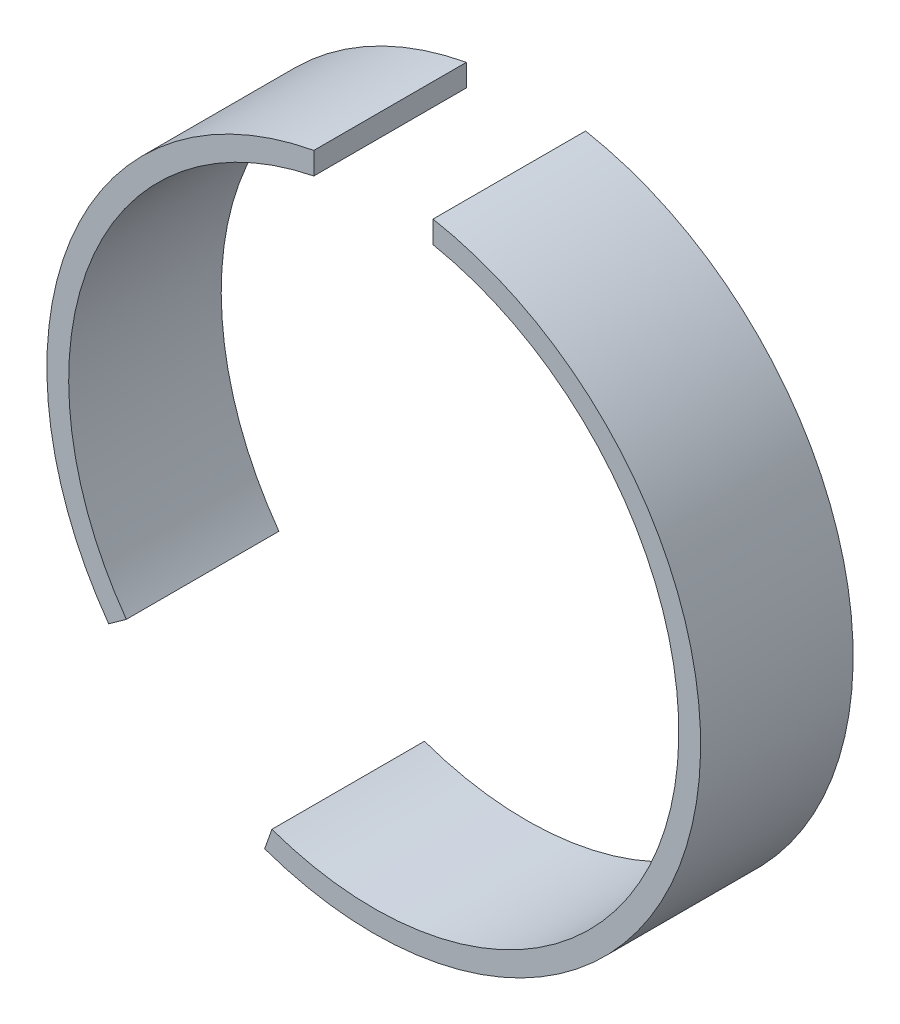
ISO-10303-21;
HEADER;
FILE_DESCRIPTION(('STEP AP214'),'2;1');
FILE_NAME('part.step','',(''),(''),'','','');
FILE_SCHEMA(('AUTOMOTIVE_DESIGN { 1 0 10303 214 1 1 1 1 }'));
ENDSEC;
DATA;
#1=APPLICATION_CONTEXT('core data for automotive mechanical design processes');
#2=APPLICATION_PROTOCOL_DEFINITION('international standard','automotive_design',2000,#1);
#3=PRODUCT_CONTEXT('',#1,'mechanical');
#4=PRODUCT('Part','Part','',(#3));
#5=PRODUCT_RELATED_PRODUCT_CATEGORY('part','',(#4));
#6=PRODUCT_DEFINITION_FORMATION('','',#4);
#7=PRODUCT_DEFINITION_CONTEXT('part definition',#1,'design');
#8=PRODUCT_DEFINITION('design','',#6,#7);
#9=PRODUCT_DEFINITION_SHAPE('','',#8);
#10=(LENGTH_UNIT() NAMED_UNIT(*) SI_UNIT(.MILLI.,.METRE.));
#11=(NAMED_UNIT(*) PLANE_ANGLE_UNIT() SI_UNIT($,.RADIAN.));
#12=(NAMED_UNIT(*) SI_UNIT($,.STERADIAN.) SOLID_ANGLE_UNIT());
#13=UNCERTAINTY_MEASURE_WITH_UNIT(LENGTH_MEASURE(1.E-05),#10,'distance_accuracy_value','');
#14=(GEOMETRIC_REPRESENTATION_CONTEXT(3) GLOBAL_UNCERTAINTY_ASSIGNED_CONTEXT((#13)) GLOBAL_UNIT_ASSIGNED_CONTEXT((#10,
#11,#12)) REPRESENTATION_CONTEXT('',''));
#15=CARTESIAN_POINT('',(0.,0.,0.));
#16=DIRECTION('',(0.,0.,1.));
#17=DIRECTION('',(1.,0.,0.));
#18=AXIS2_PLACEMENT_3D('',#15,#16,#17);
#19=CARTESIAN_POINT('',(0.,0.,14.));
#20=DIRECTION('',(0.,0.,-1.));
#21=DIRECTION('',(-1.,0.,0.));
#22=AXIS2_PLACEMENT_3D('',#19,#20,#21);
#23=CYLINDRICAL_SURFACE('',#22,28.);
#24=CARTESIAN_POINT('',(0.,0.,0.));
#25=DIRECTION('',(0.,0.,-1.));
#26=DIRECTION('',(1.,0.,0.));
#27=AXIS2_PLACEMENT_3D('',#24,#25,#26);
#28=CIRCLE('',#27,28.);
#29=CARTESIAN_POINT('',(-22.7044689300606,-16.3861859687944,0.));
#30=VERTEX_POINT('',#29);
#31=CARTESIAN_POINT('',(-5.50000000000001,27.4545078265847,0.));
#32=VERTEX_POINT('',#31);
#33=EDGE_CURVE('E112',#30,#32,#28,.T.);
#34=ORIENTED_EDGE('',*,*,#33,.T.);
#35=DIRECTION('',(0.,0.,-1.));
#36=VECTOR('',#35,1.);
#37=CARTESIAN_POINT('',(-5.50000000000001,27.4545078265847,14.));
#38=LINE('',#37,#36);
#39=CARTESIAN_POINT('',(-5.50000000000001,27.4545078265847,14.));
#40=VERTEX_POINT('',#39);
#41=EDGE_CURVE('E12',#40,#32,#38,.T.);
#42=ORIENTED_EDGE('',*,*,#41,.F.);
#43=CARTESIAN_POINT('',(0.,0.,14.));
#44=DIRECTION('',(0.,0.,-1.));
#45=DIRECTION('',(1.,0.,0.));
#46=AXIS2_PLACEMENT_3D('',#43,#44,#45);
#47=CIRCLE('',#46,28.);
#48=CARTESIAN_POINT('',(-22.7044689300606,-16.3861859687944,14.));
#49=VERTEX_POINT('',#48);
#50=EDGE_CURVE('E100',#49,#40,#47,.T.);
#51=ORIENTED_EDGE('',*,*,#50,.F.);
#52=DIRECTION('',(0.,0.,-1.));
#53=VECTOR('',#52,1.);
#54=CARTESIAN_POINT('',(-22.7044689300606,-16.3861859687944,14.));
#55=LINE('',#54,#53);
#56=EDGE_CURVE('E108',#49,#30,#55,.T.);
#57=ORIENTED_EDGE('',*,*,#56,.T.);
#58=EDGE_LOOP('',(#34,#42,#51,#57));
#59=FACE_BOUND('',#58,.T.);
#60=ADVANCED_FACE('F49',(#59),#23,.F.);
#61=CARTESIAN_POINT('',(-5.50000000000001,29.4915242061173,14.));
#62=DIRECTION('',(-1.,0.,0.));
#63=DIRECTION('',(0.,0.,1.));
#64=AXIS2_PLACEMENT_3D('',#61,#62,#63);
#65=PLANE('',#64);
#66=DIRECTION('',(0.,1.,0.));
#67=VECTOR('',#66,1.);
#68=CARTESIAN_POINT('',(-5.50000000000001,29.4915242061173,0.));
#69=LINE('',#68,#67);
#70=CARTESIAN_POINT('',(-5.5,29.4915242061173,0.));
#71=VERTEX_POINT('',#70);
#72=EDGE_CURVE('E104',#32,#71,#69,.T.);
#73=ORIENTED_EDGE('',*,*,#72,.T.);
#74=DIRECTION('',(0.,0.,-1.));
#75=VECTOR('',#74,1.);
#76=CARTESIAN_POINT('',(-5.5,29.4915242061173,14.));
#77=LINE('',#76,#75);
#78=CARTESIAN_POINT('',(-5.5,29.4915242061173,14.));
#79=VERTEX_POINT('',#78);
#80=EDGE_CURVE('E57',#79,#71,#77,.T.);
#81=ORIENTED_EDGE('',*,*,#80,.F.);
#82=DIRECTION('',(0.,1.,0.));
#83=VECTOR('',#82,1.);
#84=CARTESIAN_POINT('',(-5.50000000000001,29.4915242061173,14.));
#85=LINE('',#84,#83);
#86=EDGE_CURVE('E95',#40,#79,#85,.T.);
#87=ORIENTED_EDGE('',*,*,#86,.F.);
#88=ORIENTED_EDGE('',*,*,#41,.T.);
#89=EDGE_LOOP('',(#73,#81,#87,#88));
#90=FACE_BOUND('',#89,.T.);
#91=ADVANCED_FACE('F103',(#90),#65,.F.);
#92=CARTESIAN_POINT('',(0.,0.,14.));
#93=DIRECTION('',(0.,0.,-1.));
#94=DIRECTION('',(-1.,0.,0.));
#95=AXIS2_PLACEMENT_3D('',#92,#93,#94);
#96=CYLINDRICAL_SURFACE('',#95,30.);
#97=CARTESIAN_POINT('',(0.,0.,0.));
#98=DIRECTION('',(0.,0.,1.));
#99=DIRECTION('',(1.,0.,0.));
#100=AXIS2_PLACEMENT_3D('',#97,#98,#99);
#101=CIRCLE('',#100,30.);
#102=CARTESIAN_POINT('',(-24.3262167107792,-17.5566278237082,0.));
#103=VERTEX_POINT('',#102);
#104=EDGE_CURVE('E82',#71,#103,#101,.T.);
#105=ORIENTED_EDGE('',*,*,#104,.T.);
#106=DIRECTION('',(0.,0.,-1.));
#107=VECTOR('',#106,1.);
#108=CARTESIAN_POINT('',(-24.3262167107792,-17.5566278237082,14.));
#109=LINE('',#108,#107);
#110=CARTESIAN_POINT('',(-24.3262167107792,-17.5566278237082,14.));
#111=VERTEX_POINT('',#110);
#112=EDGE_CURVE('E105',#111,#103,#109,.T.);
#113=ORIENTED_EDGE('',*,*,#112,.F.);
#114=CARTESIAN_POINT('',(0.,0.,14.));
#115=DIRECTION('',(0.,0.,1.));
#116=DIRECTION('',(1.,0.,0.));
#117=AXIS2_PLACEMENT_3D('',#114,#115,#116);
#118=CIRCLE('',#117,30.);
#119=EDGE_CURVE('E98',#79,#111,#118,.T.);
#120=ORIENTED_EDGE('',*,*,#119,.F.);
#121=ORIENTED_EDGE('',*,*,#80,.T.);
#122=EDGE_LOOP('',(#105,#113,#120,#121));
#123=FACE_BOUND('',#122,.T.);
#124=ADVANCED_FACE('F106',(#123),#96,.T.);
#125=CARTESIAN_POINT('',(-24.3262167107792,-17.5566278237082,14.));
#126=DIRECTION('',(-0.58522092745694,0.810873890359308,0.));
#127=DIRECTION('',(-0.810873890359308,-0.58522092745694,0.));
#128=AXIS2_PLACEMENT_3D('',#125,#126,#127);
#129=PLANE('',#128);
#130=DIRECTION('',(0.810873890359308,0.58522092745694,0.));
#131=VECTOR('',#130,1.);
#132=CARTESIAN_POINT('',(-24.3262167107792,-17.5566278237082,0.));
#133=LINE('',#132,#131);
#134=EDGE_CURVE('E88',#103,#30,#133,.T.);
#135=ORIENTED_EDGE('',*,*,#134,.T.);
#136=ORIENTED_EDGE('',*,*,#56,.F.);
#137=DIRECTION('',(0.810873890359308,0.58522092745694,0.));
#138=VECTOR('',#137,1.);
#139=CARTESIAN_POINT('',(-24.3262167107792,-17.5566278237082,14.));
#140=LINE('',#139,#138);
#141=EDGE_CURVE('E65',#111,#49,#140,.T.);
#142=ORIENTED_EDGE('',*,*,#141,.F.);
#143=ORIENTED_EDGE('',*,*,#112,.T.);
#144=EDGE_LOOP('',(#135,#136,#142,#143));
#145=FACE_BOUND('',#144,.T.);
#146=ADVANCED_FACE('F119',(#145),#129,.F.);
#147=CARTESIAN_POINT('',(0.,0.,14.));
#148=DIRECTION('',(0.,0.,1.));
#149=DIRECTION('',(1.,0.,0.));
#150=AXIS2_PLACEMENT_3D('',#147,#148,#149);
#151=PLANE('',#150);
#152=ORIENTED_EDGE('',*,*,#50,.T.);
#153=ORIENTED_EDGE('',*,*,#86,.T.);
#154=ORIENTED_EDGE('',*,*,#119,.T.);
#155=ORIENTED_EDGE('',*,*,#141,.T.);
#156=EDGE_LOOP('',(#152,#153,#154,#155));
#157=FACE_BOUND('',#156,.T.);
#158=ADVANCED_FACE('F96',(#157),#151,.T.);
#159=CARTESIAN_POINT('',(0.,0.,0.));
#160=DIRECTION('',(0.,0.,1.));
#161=DIRECTION('',(1.,0.,0.));
#162=AXIS2_PLACEMENT_3D('',#159,#160,#161);
#163=PLANE('',#162);
#164=ORIENTED_EDGE('',*,*,#33,.F.);
#165=ORIENTED_EDGE('',*,*,#134,.F.);
#166=ORIENTED_EDGE('',*,*,#104,.F.);
#167=ORIENTED_EDGE('',*,*,#72,.F.);
#168=EDGE_LOOP('',(#164,#165,#166,#167));
#169=FACE_BOUND('',#168,.T.);
#170=ADVANCED_FACE('F122',(#169),#163,.F.);
#171=CLOSED_SHELL('',(#60,#91,#124,#146,#158,#170));
#172=MANIFOLD_SOLID_BREP('B2',#171);
#173=CARTESIAN_POINT('',(0.,0.,14.));
#174=DIRECTION('',(0.,0.,-1.));
#175=DIRECTION('',(-1.,0.,0.));
#176=AXIS2_PLACEMENT_3D('',#173,#174,#175);
#177=CYLINDRICAL_SURFACE('',#176,28.);
#178=CARTESIAN_POINT('',(0.,0.,0.));
#179=DIRECTION('',(0.,0.,-1.));
#180=DIRECTION('',(1.,0.,0.));
#181=AXIS2_PLACEMENT_3D('',#178,#179,#180);
#182=CIRCLE('',#181,28.);
#183=CARTESIAN_POINT('',(5.4399636048201,27.4664667545397,0.));
#184=VERTEX_POINT('',#183);
#185=CARTESIAN_POINT('',(-9.34637864421615,-26.3940373235877,0.));
#186=VERTEX_POINT('',#185);
#187=EDGE_CURVE('E241',#184,#186,#182,.T.);
#188=ORIENTED_EDGE('',*,*,#187,.T.);
#189=DIRECTION('',(0.,0.,-1.));
#190=VECTOR('',#189,1.);
#191=CARTESIAN_POINT('',(-9.34637864421615,-26.3940373235877,14.));
#192=LINE('',#191,#190);
#193=CARTESIAN_POINT('',(-9.34637864421615,-26.3940373235877,14.));
#194=VERTEX_POINT('',#193);
#195=EDGE_CURVE('E47',#194,#186,#192,.T.);
#196=ORIENTED_EDGE('',*,*,#195,.F.);
#197=CARTESIAN_POINT('',(0.,0.,14.));
#198=DIRECTION('',(0.,0.,-1.));
#199=DIRECTION('',(1.,0.,0.));
#200=AXIS2_PLACEMENT_3D('',#197,#198,#199);
#201=CIRCLE('',#200,28.);
#202=CARTESIAN_POINT('',(5.4399636048201,27.4664667545397,14.));
#203=VERTEX_POINT('',#202);
#204=EDGE_CURVE('E225',#203,#194,#201,.T.);
#205=ORIENTED_EDGE('',*,*,#204,.F.);
#206=DIRECTION('',(0.,0.,-1.));
#207=VECTOR('',#206,1.);
#208=CARTESIAN_POINT('',(5.4399636048201,27.4664667545397,14.));
#209=LINE('',#208,#207);
#210=EDGE_CURVE('E237',#203,#184,#209,.T.);
#211=ORIENTED_EDGE('',*,*,#210,.T.);
#212=EDGE_LOOP('',(#188,#196,#205,#211));
#213=FACE_BOUND('',#212,.T.);
#214=ADVANCED_FACE('F173',(#213),#177,.F.);
#215=CARTESIAN_POINT('',(-9.34637864421615,-26.3940373235877,14.));
#216=DIRECTION('',(0.942644190128132,-0.333799237293434,0.));
#217=DIRECTION('',(0.333799237293434,0.942644190128132,0.));
#218=AXIS2_PLACEMENT_3D('',#215,#216,#217);
#219=PLANE('',#218);
#220=DIRECTION('',(-0.333799237293434,-0.942644190128132,0.));
#221=VECTOR('',#220,1.);
#222=CARTESIAN_POINT('',(-9.34637864421615,-26.3940373235877,0.));
#223=LINE('',#222,#221);
#224=CARTESIAN_POINT('',(-10.013977118803,-28.279325703844,0.));
#225=VERTEX_POINT('',#224);
#226=EDGE_CURVE('E230',#186,#225,#223,.T.);
#227=ORIENTED_EDGE('',*,*,#226,.T.);
#228=DIRECTION('',(0.,0.,-1.));
#229=VECTOR('',#228,1.);
#230=CARTESIAN_POINT('',(-10.013977118803,-28.279325703844,14.));
#231=LINE('',#230,#229);
#232=CARTESIAN_POINT('',(-10.013977118803,-28.279325703844,14.));
#233=VERTEX_POINT('',#232);
#234=EDGE_CURVE('E182',#233,#225,#231,.T.);
#235=ORIENTED_EDGE('',*,*,#234,.F.);
#236=DIRECTION('',(-0.333799237293434,-0.942644190128132,0.));
#237=VECTOR('',#236,1.);
#238=CARTESIAN_POINT('',(-9.34637864421615,-26.3940373235877,14.));
#239=LINE('',#238,#237);
#240=EDGE_CURVE('E220',#194,#233,#239,.T.);
#241=ORIENTED_EDGE('',*,*,#240,.F.);
#242=ORIENTED_EDGE('',*,*,#195,.T.);
#243=EDGE_LOOP('',(#227,#235,#241,#242));
#244=FACE_BOUND('',#243,.T.);
#245=ADVANCED_FACE('F229',(#244),#219,.F.);
#246=CARTESIAN_POINT('',(0.,0.,14.));
#247=DIRECTION('',(0.,0.,-1.));
#248=DIRECTION('',(-1.,0.,0.));
#249=AXIS2_PLACEMENT_3D('',#246,#247,#248);
#250=CYLINDRICAL_SURFACE('',#249,30.);
#251=CARTESIAN_POINT('',(0.,0.,0.));
#252=DIRECTION('',(0.,0.,1.));
#253=DIRECTION('',(1.,0.,0.));
#254=AXIS2_PLACEMENT_3D('',#251,#252,#253);
#255=CIRCLE('',#254,30.);
#256=CARTESIAN_POINT('',(5.4399636048201,29.5026574392585,0.));
#257=VERTEX_POINT('',#256);
#258=EDGE_CURVE('E207',#225,#257,#255,.T.);
#259=ORIENTED_EDGE('',*,*,#258,.T.);
#260=DIRECTION('',(0.,0.,-1.));
#261=VECTOR('',#260,1.);
#262=CARTESIAN_POINT('',(5.4399636048201,29.5026574392585,14.));
#263=LINE('',#262,#261);
#264=CARTESIAN_POINT('',(5.4399636048201,29.5026574392585,14.));
#265=VERTEX_POINT('',#264);
#266=EDGE_CURVE('E232',#265,#257,#263,.T.);
#267=ORIENTED_EDGE('',*,*,#266,.F.);
#268=CARTESIAN_POINT('',(0.,0.,14.));
#269=DIRECTION('',(0.,0.,1.));
#270=DIRECTION('',(1.,0.,0.));
#271=AXIS2_PLACEMENT_3D('',#268,#269,#270);
#272=CIRCLE('',#271,30.);
#273=EDGE_CURVE('E223',#233,#265,#272,.T.);
#274=ORIENTED_EDGE('',*,*,#273,.F.);
#275=ORIENTED_EDGE('',*,*,#234,.T.);
#276=EDGE_LOOP('',(#259,#267,#274,#275));
#277=FACE_BOUND('',#276,.T.);
#278=ADVANCED_FACE('F233',(#277),#250,.T.);
#279=CARTESIAN_POINT('',(5.4399636048201,27.4664667545397,14.));
#280=DIRECTION('',(1.,0.,0.));
#281=DIRECTION('',(0.,0.,-1.));
#282=AXIS2_PLACEMENT_3D('',#279,#280,#281);
#283=PLANE('',#282);
#284=DIRECTION('',(0.,-1.,0.));
#285=VECTOR('',#284,1.);
#286=CARTESIAN_POINT('',(5.4399636048201,27.4664667545397,0.));
#287=LINE('',#286,#285);
#288=EDGE_CURVE('E213',#257,#184,#287,.T.);
#289=ORIENTED_EDGE('',*,*,#288,.T.);
#290=ORIENTED_EDGE('',*,*,#210,.F.);
#291=DIRECTION('',(0.,-1.,0.));
#292=VECTOR('',#291,1.);
#293=CARTESIAN_POINT('',(5.4399636048201,27.4664667545397,14.));
#294=LINE('',#293,#292);
#295=EDGE_CURVE('E190',#265,#203,#294,.T.);
#296=ORIENTED_EDGE('',*,*,#295,.F.);
#297=ORIENTED_EDGE('',*,*,#266,.T.);
#298=EDGE_LOOP('',(#289,#290,#296,#297));
#299=FACE_BOUND('',#298,.T.);
#300=ADVANCED_FACE('F254',(#299),#283,.F.);
#301=CARTESIAN_POINT('',(0.,0.,14.));
#302=DIRECTION('',(0.,0.,1.));
#303=DIRECTION('',(1.,0.,0.));
#304=AXIS2_PLACEMENT_3D('',#301,#302,#303);
#305=PLANE('',#304);
#306=ORIENTED_EDGE('',*,*,#204,.T.);
#307=ORIENTED_EDGE('',*,*,#240,.T.);
#308=ORIENTED_EDGE('',*,*,#273,.T.);
#309=ORIENTED_EDGE('',*,*,#295,.T.);
#310=EDGE_LOOP('',(#306,#307,#308,#309));
#311=FACE_BOUND('',#310,.T.);
#312=ADVANCED_FACE('F221',(#311),#305,.T.);
#313=CARTESIAN_POINT('',(0.,0.,0.));
#314=DIRECTION('',(0.,0.,1.));
#315=DIRECTION('',(1.,0.,0.));
#316=AXIS2_PLACEMENT_3D('',#313,#314,#315);
#317=PLANE('',#316);
#318=ORIENTED_EDGE('',*,*,#187,.F.);
#319=ORIENTED_EDGE('',*,*,#288,.F.);
#320=ORIENTED_EDGE('',*,*,#258,.F.);
#321=ORIENTED_EDGE('',*,*,#226,.F.);
#322=EDGE_LOOP('',(#318,#319,#320,#321));
#323=FACE_BOUND('',#322,.T.);
#324=ADVANCED_FACE('F257',(#323),#317,.F.);
#325=CLOSED_SHELL('',(#214,#245,#278,#300,#312,#324));
#326=MANIFOLD_SOLID_BREP('B6',#325);
#327=ADVANCED_BREP_SHAPE_REPRESENTATION('',(#18,#172,#326),#14);
#328=SHAPE_DEFINITION_REPRESENTATION(#9,#327);
ENDSEC;
END-ISO-10303-21;
